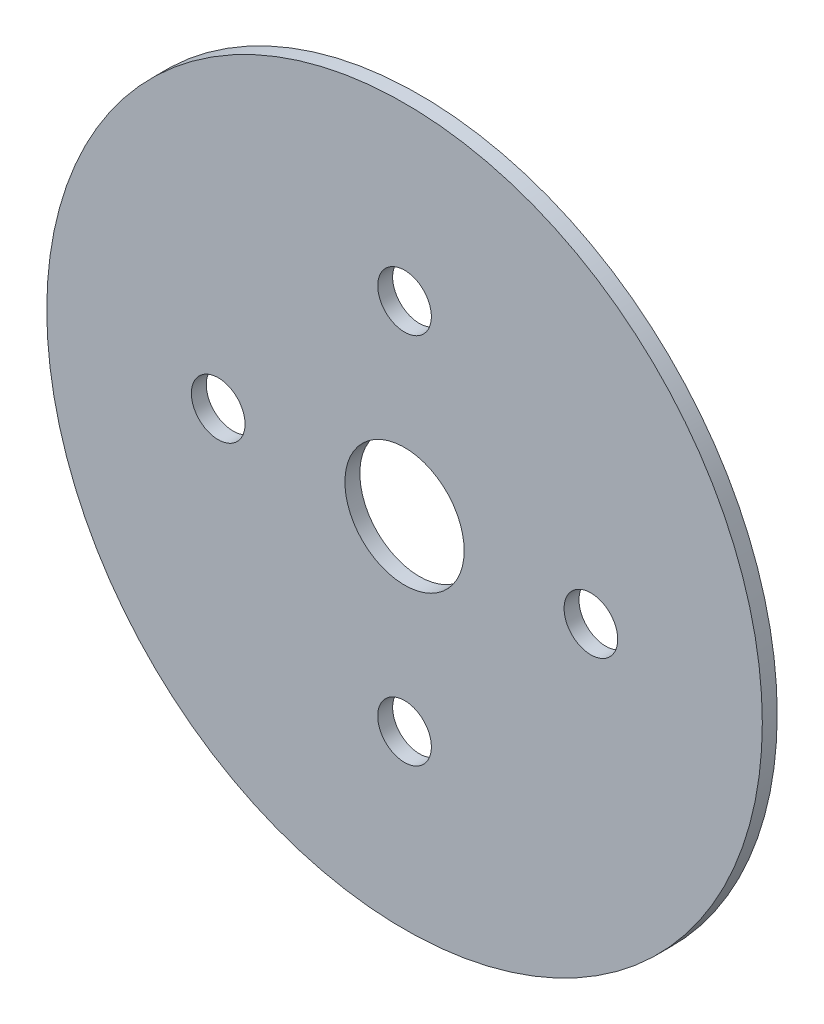
ISO-10303-21;
HEADER;
FILE_DESCRIPTION(('STEP AP214'),'2;1');
FILE_NAME('part.step','',(''),(''),'','','');
FILE_SCHEMA(('AUTOMOTIVE_DESIGN { 1 0 10303 214 1 1 1 1 }'));
ENDSEC;
DATA;
#1=APPLICATION_CONTEXT('core data for automotive mechanical design processes');
#2=APPLICATION_PROTOCOL_DEFINITION('international standard','automotive_design',2000,#1);
#3=PRODUCT_CONTEXT('',#1,'mechanical');
#4=PRODUCT('Part','Part','',(#3));
#5=PRODUCT_RELATED_PRODUCT_CATEGORY('part','',(#4));
#6=PRODUCT_DEFINITION_FORMATION('','',#4);
#7=PRODUCT_DEFINITION_CONTEXT('part definition',#1,'design');
#8=PRODUCT_DEFINITION('design','',#6,#7);
#9=PRODUCT_DEFINITION_SHAPE('','',#8);
#10=(LENGTH_UNIT() NAMED_UNIT(*) SI_UNIT(.MILLI.,.METRE.));
#11=(NAMED_UNIT(*) PLANE_ANGLE_UNIT() SI_UNIT($,.RADIAN.));
#12=(NAMED_UNIT(*) SI_UNIT($,.STERADIAN.) SOLID_ANGLE_UNIT());
#13=UNCERTAINTY_MEASURE_WITH_UNIT(LENGTH_MEASURE(1.E-05),#10,'distance_accuracy_value','');
#14=(GEOMETRIC_REPRESENTATION_CONTEXT(3) GLOBAL_UNCERTAINTY_ASSIGNED_CONTEXT((#13)) GLOBAL_UNIT_ASSIGNED_CONTEXT((#10,
#11,#12)) REPRESENTATION_CONTEXT('',''));
#15=CARTESIAN_POINT('',(0.,0.,0.));
#16=DIRECTION('',(0.,0.,1.));
#17=DIRECTION('',(1.,0.,0.));
#18=AXIS2_PLACEMENT_3D('',#15,#16,#17);
#19=CARTESIAN_POINT('',(0.,0.,1.27));
#20=DIRECTION('',(0.,0.,1.));
#21=DIRECTION('',(1.,0.,0.));
#22=AXIS2_PLACEMENT_3D('',#19,#20,#21);
#23=PLANE('',#22);
#24=CARTESIAN_POINT('',(0.,-15.875,1.27));
#25=DIRECTION('',(0.,0.,1.));
#26=DIRECTION('',(1.,0.,0.));
#27=AXIS2_PLACEMENT_3D('',#24,#25,#26);
#28=CIRCLE('',#27,2.286);
#29=CARTESIAN_POINT('',(2.286,-15.875,1.27));
#30=VERTEX_POINT('',#29);
#31=EDGE_CURVE('E78',#30,#30,#28,.T.);
#32=ORIENTED_EDGE('',*,*,#31,.F.);
#33=EDGE_LOOP('',(#32));
#34=FACE_BOUND('',#33,.T.);
#35=CARTESIAN_POINT('',(0.,15.875,1.27));
#36=DIRECTION('',(0.,0.,1.));
#37=DIRECTION('',(1.,0.,0.));
#38=AXIS2_PLACEMENT_3D('',#35,#36,#37);
#39=CIRCLE('',#38,2.286);
#40=CARTESIAN_POINT('',(2.286,15.875,1.27));
#41=VERTEX_POINT('',#40);
#42=EDGE_CURVE('E62',#41,#41,#39,.T.);
#43=ORIENTED_EDGE('',*,*,#42,.F.);
#44=EDGE_LOOP('',(#43));
#45=FACE_BOUND('',#44,.T.);
#46=CARTESIAN_POINT('',(0.,0.,1.27));
#47=DIRECTION('',(0.,0.,1.));
#48=DIRECTION('',(1.,0.,0.));
#49=AXIS2_PLACEMENT_3D('',#46,#47,#48);
#50=CIRCLE('',#49,30.48);
#51=CARTESIAN_POINT('',(30.48,0.,1.27));
#52=VERTEX_POINT('',#51);
#53=EDGE_CURVE('E10',#52,#52,#50,.T.);
#54=ORIENTED_EDGE('',*,*,#53,.T.);
#55=EDGE_LOOP('',(#54));
#56=FACE_BOUND('',#55,.T.);
#57=CARTESIAN_POINT('',(0.,0.,1.27));
#58=DIRECTION('',(0.,0.,1.));
#59=DIRECTION('',(1.,0.,0.));
#60=AXIS2_PLACEMENT_3D('',#57,#58,#59);
#61=CIRCLE('',#60,5.08);
#62=CARTESIAN_POINT('',(5.08,0.,1.27));
#63=VERTEX_POINT('',#62);
#64=EDGE_CURVE('E56',#63,#63,#61,.T.);
#65=ORIENTED_EDGE('',*,*,#64,.F.);
#66=EDGE_LOOP('',(#65));
#67=FACE_BOUND('',#66,.T.);
#68=CARTESIAN_POINT('',(15.875,0.,1.27));
#69=DIRECTION('',(0.,0.,1.));
#70=DIRECTION('',(1.,0.,0.));
#71=AXIS2_PLACEMENT_3D('',#68,#69,#70);
#72=CIRCLE('',#71,2.286);
#73=CARTESIAN_POINT('',(18.161,0.,1.27));
#74=VERTEX_POINT('',#73);
#75=EDGE_CURVE('E70',#74,#74,#72,.T.);
#76=ORIENTED_EDGE('',*,*,#75,.F.);
#77=EDGE_LOOP('',(#76));
#78=FACE_BOUND('',#77,.T.);
#79=CARTESIAN_POINT('',(-15.875,0.,1.27));
#80=DIRECTION('',(0.,0.,1.));
#81=DIRECTION('',(1.,0.,0.));
#82=AXIS2_PLACEMENT_3D('',#79,#80,#81);
#83=CIRCLE('',#82,2.286);
#84=CARTESIAN_POINT('',(-13.589,0.,1.27));
#85=VERTEX_POINT('',#84);
#86=EDGE_CURVE('E86',#85,#85,#83,.T.);
#87=ORIENTED_EDGE('',*,*,#86,.F.);
#88=EDGE_LOOP('',(#87));
#89=FACE_BOUND('',#88,.T.);
#90=ADVANCED_FACE('F43',(#34,#45,#56,#67,#78,#89),#23,.T.);
#91=CARTESIAN_POINT('',(0.,0.,0.));
#92=DIRECTION('',(0.,0.,1.));
#93=DIRECTION('',(1.,0.,0.));
#94=AXIS2_PLACEMENT_3D('',#91,#92,#93);
#95=PLANE('',#94);
#96=CARTESIAN_POINT('',(0.,0.,0.));
#97=DIRECTION('',(0.,0.,1.));
#98=DIRECTION('',(1.,0.,0.));
#99=AXIS2_PLACEMENT_3D('',#96,#97,#98);
#100=CIRCLE('',#99,30.48);
#101=CARTESIAN_POINT('',(30.48,0.,0.));
#102=VERTEX_POINT('',#101);
#103=EDGE_CURVE('E47',#102,#102,#100,.T.);
#104=ORIENTED_EDGE('',*,*,#103,.F.);
#105=EDGE_LOOP('',(#104));
#106=FACE_BOUND('',#105,.T.);
#107=CARTESIAN_POINT('',(0.,0.,0.));
#108=DIRECTION('',(0.,0.,1.));
#109=DIRECTION('',(1.,0.,0.));
#110=AXIS2_PLACEMENT_3D('',#107,#108,#109);
#111=CIRCLE('',#110,5.08);
#112=CARTESIAN_POINT('',(5.08,0.,0.));
#113=VERTEX_POINT('',#112);
#114=EDGE_CURVE('E58',#113,#113,#111,.T.);
#115=ORIENTED_EDGE('',*,*,#114,.T.);
#116=EDGE_LOOP('',(#115));
#117=FACE_BOUND('',#116,.T.);
#118=CARTESIAN_POINT('',(0.,15.875,0.));
#119=DIRECTION('',(0.,0.,1.));
#120=DIRECTION('',(1.,0.,0.));
#121=AXIS2_PLACEMENT_3D('',#118,#119,#120);
#122=CIRCLE('',#121,2.286);
#123=CARTESIAN_POINT('',(2.286,15.875,0.));
#124=VERTEX_POINT('',#123);
#125=EDGE_CURVE('E66',#124,#124,#122,.T.);
#126=ORIENTED_EDGE('',*,*,#125,.T.);
#127=EDGE_LOOP('',(#126));
#128=FACE_BOUND('',#127,.T.);
#129=CARTESIAN_POINT('',(15.875,0.,0.));
#130=DIRECTION('',(0.,0.,1.));
#131=DIRECTION('',(1.,0.,0.));
#132=AXIS2_PLACEMENT_3D('',#129,#130,#131);
#133=CIRCLE('',#132,2.286);
#134=CARTESIAN_POINT('',(18.161,0.,0.));
#135=VERTEX_POINT('',#134);
#136=EDGE_CURVE('E74',#135,#135,#133,.T.);
#137=ORIENTED_EDGE('',*,*,#136,.T.);
#138=EDGE_LOOP('',(#137));
#139=FACE_BOUND('',#138,.T.);
#140=CARTESIAN_POINT('',(0.,-15.875,0.));
#141=DIRECTION('',(0.,0.,1.));
#142=DIRECTION('',(1.,0.,0.));
#143=AXIS2_PLACEMENT_3D('',#140,#141,#142);
#144=CIRCLE('',#143,2.286);
#145=CARTESIAN_POINT('',(2.286,-15.875,0.));
#146=VERTEX_POINT('',#145);
#147=EDGE_CURVE('E82',#146,#146,#144,.T.);
#148=ORIENTED_EDGE('',*,*,#147,.T.);
#149=EDGE_LOOP('',(#148));
#150=FACE_BOUND('',#149,.T.);
#151=CARTESIAN_POINT('',(-15.875,0.,0.));
#152=DIRECTION('',(0.,0.,1.));
#153=DIRECTION('',(1.,0.,0.));
#154=AXIS2_PLACEMENT_3D('',#151,#152,#153);
#155=CIRCLE('',#154,2.286);
#156=CARTESIAN_POINT('',(-13.589,0.,0.));
#157=VERTEX_POINT('',#156);
#158=EDGE_CURVE('E90',#157,#157,#155,.T.);
#159=ORIENTED_EDGE('',*,*,#158,.T.);
#160=EDGE_LOOP('',(#159));
#161=FACE_BOUND('',#160,.T.);
#162=ADVANCED_FACE('F102',(#106,#117,#128,#139,#150,#161),#95,.F.);
#163=CARTESIAN_POINT('',(0.,0.,1.27));
#164=DIRECTION('',(0.,0.,-1.));
#165=DIRECTION('',(-1.,0.,0.));
#166=AXIS2_PLACEMENT_3D('',#163,#164,#165);
#167=CYLINDRICAL_SURFACE('',#166,30.48);
#168=ORIENTED_EDGE('',*,*,#53,.F.);
#169=EDGE_LOOP('',(#168));
#170=FACE_BOUND('',#169,.T.);
#171=ORIENTED_EDGE('',*,*,#103,.T.);
#172=EDGE_LOOP('',(#171));
#173=FACE_BOUND('',#172,.T.);
#174=ADVANCED_FACE('F45',(#170,#173),#167,.T.);
#175=CARTESIAN_POINT('',(0.,0.,1.27));
#176=DIRECTION('',(0.,0.,-1.));
#177=DIRECTION('',(-1.,0.,0.));
#178=AXIS2_PLACEMENT_3D('',#175,#176,#177);
#179=CYLINDRICAL_SURFACE('',#178,5.08);
#180=ORIENTED_EDGE('',*,*,#64,.T.);
#181=EDGE_LOOP('',(#180));
#182=FACE_BOUND('',#181,.T.);
#183=ORIENTED_EDGE('',*,*,#114,.F.);
#184=EDGE_LOOP('',(#183));
#185=FACE_BOUND('',#184,.T.);
#186=ADVANCED_FACE('F112',(#182,#185),#179,.F.);
#187=CARTESIAN_POINT('',(0.,15.875,1.27));
#188=DIRECTION('',(0.,0.,-1.));
#189=DIRECTION('',(-1.,0.,0.));
#190=AXIS2_PLACEMENT_3D('',#187,#188,#189);
#191=CYLINDRICAL_SURFACE('',#190,2.286);
#192=ORIENTED_EDGE('',*,*,#42,.T.);
#193=EDGE_LOOP('',(#192));
#194=FACE_BOUND('',#193,.T.);
#195=ORIENTED_EDGE('',*,*,#125,.F.);
#196=EDGE_LOOP('',(#195));
#197=FACE_BOUND('',#196,.T.);
#198=ADVANCED_FACE('F115',(#194,#197),#191,.F.);
#199=CARTESIAN_POINT('',(15.875,0.,1.27));
#200=DIRECTION('',(0.,0.,-1.));
#201=DIRECTION('',(-1.,0.,0.));
#202=AXIS2_PLACEMENT_3D('',#199,#200,#201);
#203=CYLINDRICAL_SURFACE('',#202,2.286);
#204=ORIENTED_EDGE('',*,*,#75,.T.);
#205=EDGE_LOOP('',(#204));
#206=FACE_BOUND('',#205,.T.);
#207=ORIENTED_EDGE('',*,*,#136,.F.);
#208=EDGE_LOOP('',(#207));
#209=FACE_BOUND('',#208,.T.);
#210=ADVANCED_FACE('F119',(#206,#209),#203,.F.);
#211=CARTESIAN_POINT('',(0.,-15.875,1.27));
#212=DIRECTION('',(0.,0.,-1.));
#213=DIRECTION('',(-1.,0.,0.));
#214=AXIS2_PLACEMENT_3D('',#211,#212,#213);
#215=CYLINDRICAL_SURFACE('',#214,2.286);
#216=ORIENTED_EDGE('',*,*,#31,.T.);
#217=EDGE_LOOP('',(#216));
#218=FACE_BOUND('',#217,.T.);
#219=ORIENTED_EDGE('',*,*,#147,.F.);
#220=EDGE_LOOP('',(#219));
#221=FACE_BOUND('',#220,.T.);
#222=ADVANCED_FACE('F123',(#218,#221),#215,.F.);
#223=CARTESIAN_POINT('',(-15.875,0.,1.27));
#224=DIRECTION('',(0.,0.,-1.));
#225=DIRECTION('',(-1.,0.,0.));
#226=AXIS2_PLACEMENT_3D('',#223,#224,#225);
#227=CYLINDRICAL_SURFACE('',#226,2.286);
#228=ORIENTED_EDGE('',*,*,#86,.T.);
#229=EDGE_LOOP('',(#228));
#230=FACE_BOUND('',#229,.T.);
#231=ORIENTED_EDGE('',*,*,#158,.F.);
#232=EDGE_LOOP('',(#231));
#233=FACE_BOUND('',#232,.T.);
#234=ADVANCED_FACE('F98',(#230,#233),#227,.F.);
#235=CLOSED_SHELL('',(#90,#162,#174,#186,#198,#210,#222,#234));
#236=MANIFOLD_SOLID_BREP('B2',#235);
#237=ADVANCED_BREP_SHAPE_REPRESENTATION('',(#18,#236),#14);
#238=SHAPE_DEFINITION_REPRESENTATION(#9,#237);
ENDSEC;
END-ISO-10303-21;
